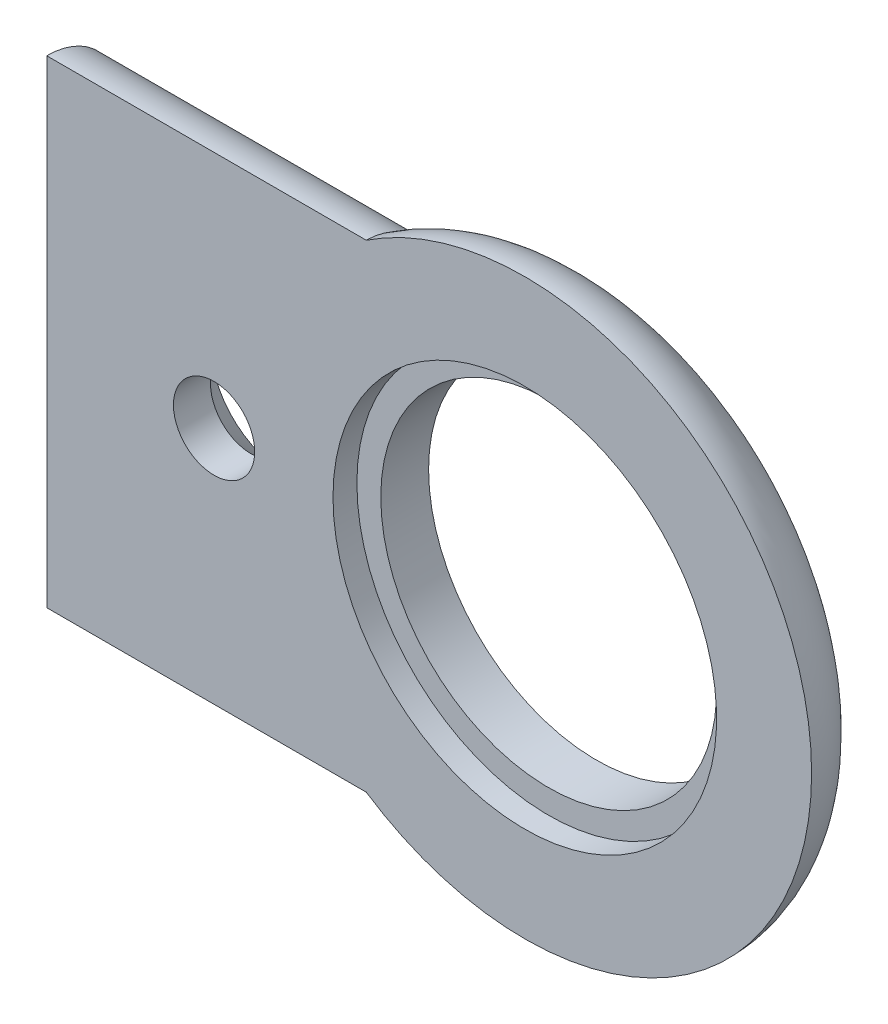
ISO-10303-21;
HEADER;
FILE_DESCRIPTION(('STEP AP214'),'2;1');
FILE_NAME('part.step','',(''),(''),'','','');
FILE_SCHEMA(('AUTOMOTIVE_DESIGN { 1 0 10303 214 1 1 1 1 }'));
ENDSEC;
DATA;
#1=APPLICATION_CONTEXT('core data for automotive mechanical design processes');
#2=APPLICATION_PROTOCOL_DEFINITION('international standard','automotive_design',2000,#1);
#3=PRODUCT_CONTEXT('',#1,'mechanical');
#4=PRODUCT('Part','Part','',(#3));
#5=PRODUCT_RELATED_PRODUCT_CATEGORY('part','',(#4));
#6=PRODUCT_DEFINITION_FORMATION('','',#4);
#7=PRODUCT_DEFINITION_CONTEXT('part definition',#1,'design');
#8=PRODUCT_DEFINITION('design','',#6,#7);
#9=PRODUCT_DEFINITION_SHAPE('','',#8);
#10=(LENGTH_UNIT() NAMED_UNIT(*) SI_UNIT(.MILLI.,.METRE.));
#11=(NAMED_UNIT(*) PLANE_ANGLE_UNIT() SI_UNIT($,.RADIAN.));
#12=(NAMED_UNIT(*) SI_UNIT($,.STERADIAN.) SOLID_ANGLE_UNIT());
#13=UNCERTAINTY_MEASURE_WITH_UNIT(LENGTH_MEASURE(1.E-05),#10,'distance_accuracy_value','');
#14=(GEOMETRIC_REPRESENTATION_CONTEXT(3) GLOBAL_UNCERTAINTY_ASSIGNED_CONTEXT((#13)) GLOBAL_UNIT_ASSIGNED_CONTEXT((#10,
#11,#12)) REPRESENTATION_CONTEXT('',''));
#15=CARTESIAN_POINT('',(0.,0.,0.));
#16=DIRECTION('',(0.,0.,1.));
#17=DIRECTION('',(1.,0.,0.));
#18=AXIS2_PLACEMENT_3D('',#15,#16,#17);
#19=CARTESIAN_POINT('',(145.,-12.01,3.));
#20=DIRECTION('',(1.,0.,0.));
#21=DIRECTION('',(0.,0.,-1.));
#22=AXIS2_PLACEMENT_3D('',#19,#20,#21);
#23=PLANE('',#22);
#24=CARTESIAN_POINT('',(145.,7.00000000000002,3.));
#25=DIRECTION('',(1.,0.,0.));
#26=DIRECTION('',(0.,0.,-1.));
#27=AXIS2_PLACEMENT_3D('',#24,#25,#26);
#28=CIRCLE('',#27,3.);
#29=CARTESIAN_POINT('',(145.,10.,3.));
#30=VERTEX_POINT('',#29);
#31=CARTESIAN_POINT('',(145.,7.00000000000002,0.));
#32=VERTEX_POINT('',#31);
#33=EDGE_CURVE('E49',#30,#32,#28,.F.);
#34=ORIENTED_EDGE('',*,*,#33,.T.);
#35=DIRECTION('',(0.,1.,0.));
#36=VECTOR('',#35,1.);
#37=CARTESIAN_POINT('',(145.,0.,0.));
#38=LINE('',#37,#36);
#39=CARTESIAN_POINT('',(145.,-7.00000000000002,0.));
#40=VERTEX_POINT('',#39);
#41=EDGE_CURVE('E92',#40,#32,#38,.T.);
#42=ORIENTED_EDGE('',*,*,#41,.F.);
#43=CARTESIAN_POINT('',(145.,-7.00000000000002,3.));
#44=DIRECTION('',(1.,0.,0.));
#45=DIRECTION('',(0.,0.,-1.));
#46=AXIS2_PLACEMENT_3D('',#43,#44,#45);
#47=CIRCLE('',#46,3.);
#48=CARTESIAN_POINT('',(145.,-10.,3.));
#49=VERTEX_POINT('',#48);
#50=EDGE_CURVE('E129',#40,#49,#47,.F.);
#51=ORIENTED_EDGE('',*,*,#50,.T.);
#52=DIRECTION('',(0.,1.,0.));
#53=VECTOR('',#52,1.);
#54=CARTESIAN_POINT('',(145.,-12.01,3.));
#55=LINE('',#54,#53);
#56=EDGE_CURVE('E12',#49,#30,#55,.T.);
#57=ORIENTED_EDGE('',*,*,#56,.T.);
#58=EDGE_LOOP('',(#34,#42,#51,#57));
#59=FACE_BOUND('',#58,.T.);
#60=ADVANCED_FACE('F50',(#59),#23,.F.);
#61=CARTESIAN_POINT('',(152.,0.,3.));
#62=DIRECTION('',(0.,0.,-1.));
#63=DIRECTION('',(-1.,0.,0.));
#64=AXIS2_PLACEMENT_3D('',#61,#62,#63);
#65=PLANE('',#64);
#66=CARTESIAN_POINT('',(152.,0.,3.));
#67=DIRECTION('',(0.,0.,-1.));
#68=DIRECTION('',(-1.,0.,0.));
#69=AXIS2_PLACEMENT_3D('',#66,#67,#68);
#70=CIRCLE('',#69,1.70000000000001);
#71=CARTESIAN_POINT('',(150.3,0.,3.));
#72=VERTEX_POINT('',#71);
#73=EDGE_CURVE('E173',#72,#72,#70,.F.);
#74=ORIENTED_EDGE('',*,*,#73,.F.);
#75=EDGE_LOOP('',(#74));
#76=FACE_BOUND('',#75,.T.);
#77=DIRECTION('',(1.,0.,0.));
#78=VECTOR('',#77,1.);
#79=CARTESIAN_POINT('',(6.6332495807108,10.,3.));
#80=LINE('',#79,#78);
#81=CARTESIAN_POINT('',(158.366750419289,10.,3.));
#82=VERTEX_POINT('',#81);
#83=EDGE_CURVE('E106',#82,#30,#80,.F.);
#84=ORIENTED_EDGE('',*,*,#83,.T.);
#85=ORIENTED_EDGE('',*,*,#56,.F.);
#86=DIRECTION('',(1.,0.,0.));
#87=VECTOR('',#86,1.);
#88=CARTESIAN_POINT('',(6.6332495807108,-10.,3.));
#89=LINE('',#88,#87);
#90=CARTESIAN_POINT('',(158.366750419289,-10.,3.));
#91=VERTEX_POINT('',#90);
#92=EDGE_CURVE('E54',#49,#91,#89,.T.);
#93=ORIENTED_EDGE('',*,*,#92,.T.);
#94=CARTESIAN_POINT('',(165.,0.,3.));
#95=DIRECTION('',(0.,0.,1.));
#96=DIRECTION('',(1.,0.,0.));
#97=AXIS2_PLACEMENT_3D('',#94,#95,#96);
#98=CIRCLE('',#97,12.);
#99=EDGE_CURVE('E65',#91,#82,#98,.T.);
#100=ORIENTED_EDGE('',*,*,#99,.T.);
#101=EDGE_LOOP('',(#84,#85,#93,#100));
#102=FACE_BOUND('',#101,.T.);
#103=CARTESIAN_POINT('',(165.,0.,3.));
#104=DIRECTION('',(0.,0.,-1.));
#105=DIRECTION('',(-1.,0.,0.));
#106=AXIS2_PLACEMENT_3D('',#103,#104,#105);
#107=CIRCLE('',#106,8.025);
#108=CARTESIAN_POINT('',(156.975,0.,3.));
#109=VERTEX_POINT('',#108);
#110=EDGE_CURVE('E176',#109,#109,#107,.F.);
#111=ORIENTED_EDGE('',*,*,#110,.F.);
#112=EDGE_LOOP('',(#111));
#113=FACE_BOUND('',#112,.T.);
#114=ADVANCED_FACE('F151',(#76,#102,#113),#65,.F.);
#115=CARTESIAN_POINT('',(165.,0.,9.));
#116=DIRECTION('',(0.,0.,-1.));
#117=DIRECTION('',(-1.,0.,0.));
#118=AXIS2_PLACEMENT_3D('',#115,#116,#117);
#119=CYLINDRICAL_SURFACE('',#118,7.025);
#120=CARTESIAN_POINT('',(165.,0.,0.));
#121=DIRECTION('',(0.,0.,-1.));
#122=DIRECTION('',(-1.,0.,0.));
#123=AXIS2_PLACEMENT_3D('',#120,#121,#122);
#124=CIRCLE('',#123,7.025);
#125=CARTESIAN_POINT('',(157.975,0.,0.));
#126=VERTEX_POINT('',#125);
#127=EDGE_CURVE('E108',#126,#126,#124,.T.);
#128=ORIENTED_EDGE('',*,*,#127,.T.);
#129=EDGE_LOOP('',(#128));
#130=FACE_BOUND('',#129,.T.);
#131=CARTESIAN_POINT('',(165.,0.,2.));
#132=DIRECTION('',(0.,0.,-1.));
#133=DIRECTION('',(-1.,0.,0.));
#134=AXIS2_PLACEMENT_3D('',#131,#132,#133);
#135=CIRCLE('',#134,7.025);
#136=CARTESIAN_POINT('',(157.975,0.,2.));
#137=VERTEX_POINT('',#136);
#138=EDGE_CURVE('E111',#137,#137,#135,.T.);
#139=ORIENTED_EDGE('',*,*,#138,.F.);
#140=EDGE_LOOP('',(#139));
#141=FACE_BOUND('',#140,.T.);
#142=ADVANCED_FACE('F148',(#130,#141),#119,.F.);
#143=CARTESIAN_POINT('',(152.,0.,0.));
#144=DIRECTION('',(0.,0.,-1.));
#145=DIRECTION('',(-1.,0.,0.));
#146=AXIS2_PLACEMENT_3D('',#143,#144,#145);
#147=CONICAL_SURFACE('',#146,3.15000000000001,0.785398163397449);
#148=CARTESIAN_POINT('',(152.,0.,1.45));
#149=DIRECTION('',(0.,0.,-1.));
#150=DIRECTION('',(-1.,0.,0.));
#151=AXIS2_PLACEMENT_3D('',#148,#149,#150);
#152=CIRCLE('',#151,1.70000000000001);
#153=CARTESIAN_POINT('',(150.3,0.,1.45));
#154=VERTEX_POINT('',#153);
#155=EDGE_CURVE('E113',#154,#154,#152,.T.);
#156=ORIENTED_EDGE('',*,*,#155,.F.);
#157=EDGE_LOOP('',(#156));
#158=FACE_BOUND('',#157,.T.);
#159=CARTESIAN_POINT('',(152.,0.,0.));
#160=DIRECTION('',(0.,0.,-1.));
#161=DIRECTION('',(-1.,0.,0.));
#162=AXIS2_PLACEMENT_3D('',#159,#160,#161);
#163=CIRCLE('',#162,3.15000000000001);
#164=CARTESIAN_POINT('',(148.85,0.,0.));
#165=VERTEX_POINT('',#164);
#166=EDGE_CURVE('E187',#165,#165,#163,.T.);
#167=ORIENTED_EDGE('',*,*,#166,.T.);
#168=EDGE_LOOP('',(#167));
#169=FACE_BOUND('',#168,.T.);
#170=ADVANCED_FACE('F155',(#158,#169),#147,.F.);
#171=CARTESIAN_POINT('',(152.,0.,0.));
#172=DIRECTION('',(0.,0.,-1.));
#173=DIRECTION('',(-1.,0.,0.));
#174=AXIS2_PLACEMENT_3D('',#171,#172,#173);
#175=CYLINDRICAL_SURFACE('',#174,1.70000000000001);
#176=ORIENTED_EDGE('',*,*,#73,.T.);
#177=EDGE_LOOP('',(#176));
#178=FACE_BOUND('',#177,.T.);
#179=ORIENTED_EDGE('',*,*,#155,.T.);
#180=EDGE_LOOP('',(#179));
#181=FACE_BOUND('',#180,.T.);
#182=ADVANCED_FACE('F157',(#178,#181),#175,.F.);
#183=CARTESIAN_POINT('',(165.,0.,3.));
#184=DIRECTION('',(0.,0.,1.));
#185=DIRECTION('',(1.,0.,0.));
#186=AXIS2_PLACEMENT_3D('',#183,#184,#185);
#187=TOROIDAL_SURFACE('',#186,9.00000000000003,3.);
#188=CARTESIAN_POINT('',(158.366750419289,-10.,3.));
#189=CARTESIAN_POINT('',(158.366748406548,-10.0000098535692,2.91832282811229));
#190=CARTESIAN_POINT('',(158.367756119082,-9.99666455428936,2.83665044575724));
#191=CARTESIAN_POINT('',(158.371775128652,-9.98333938667463,2.67390816869804));
#192=CARTESIAN_POINT('',(158.374786177691,-9.97336033954348,2.59283820067585));
#193=CARTESIAN_POINT('',(158.382788912227,-9.94686684749292,2.43201561954067));
#194=CARTESIAN_POINT('',(158.387777082286,-9.93036400241241,2.35226092854911));
#195=CARTESIAN_POINT('',(158.399698197228,-9.89098718371105,2.19451150225823));
#196=CARTESIAN_POINT('',(158.406631146236,-9.86811319658087,2.11651677069111));
#197=CARTESIAN_POINT('',(158.430293603664,-9.79019724346064,1.8859770239453));
#198=CARTESIAN_POINT('',(158.449893121657,-9.72583993009606,1.73674823986862));
#199=CARTESIAN_POINT('',(158.496248267667,-9.57456313707387,1.45153923327288));
#200=CARTESIAN_POINT('',(158.523004457229,-9.48764188696214,1.31556005152108));
#201=CARTESIAN_POINT('',(158.583564045909,-9.29243006025774,1.05802041816486));
#202=CARTESIAN_POINT('',(158.617476361481,-9.18381078859014,0.936734656339628));
#203=CARTESIAN_POINT('',(158.691315052031,-8.94953613474559,0.714076543196316));
#204=CARTESIAN_POINT('',(158.731243217371,-8.82387568210235,0.612710140791636));
#205=CARTESIAN_POINT('',(158.817979114909,-8.55385703409445,0.428362189085962));
#206=CARTESIAN_POINT('',(158.864999363909,-8.40894912932895,0.346287027879205));
#207=CARTESIAN_POINT('',(158.963614617624,-8.10888057219527,0.207564462053017));
#208=CARTESIAN_POINT('',(159.015209767454,-7.95371959463985,0.150917864372315));
#209=CARTESIAN_POINT('',(159.11169754666,-7.66755910857492,0.0721961315360057));
#210=CARTESIAN_POINT('',(159.155999727501,-7.53757385301958,0.0455960045550273));
#211=CARTESIAN_POINT('',(159.246227202724,-7.27596866612548,0.00981412465071258));
#212=CARTESIAN_POINT('',(159.292149241296,-7.14435232413626,0.000599257215181667));
#213=CARTESIAN_POINT('',(159.340075831448,-7.0086847995247,9.40499600647114E-06));
#214=CARTESIAN_POINT('',(159.341610540671,-7.00434221800044,-2.38091156650686E-08));
#215=CARTESIAN_POINT('',(159.343145750508,-7.00000000000002,0.));
#216=B_SPLINE_CURVE_WITH_KNOTS('',3,(#188,#189,#190,#191,#192,#193,#194,#195,#196,#197,#198,
#199,#200,#201,#202,#203,#204,#205,#206,#207,#208,#209,#210,#211,#212,#213,#214,#215),
.UNSPECIFIED.,.F.,.F.,(4,2,2,2,2,2,2,2,2,2,2,2,2,4),(0.,0.244948450351612,0.489866583732242,
0.734351177670228,0.97883629001557,1.46742101818896,1.95604409421152,2.45272325799537,
2.94955053024501,3.46641584921098,3.98329756899188,4.40191800726715,4.81974027154332,
4.83355763866565),.UNSPECIFIED.);
#217=CARTESIAN_POINT('',(159.343145750508,-7.00000000000001,0.));
#218=VERTEX_POINT('',#217);
#219=EDGE_CURVE('E101',#218,#91,#216,.F.);
#220=ORIENTED_EDGE('',*,*,#219,.F.);
#221=CARTESIAN_POINT('',(165.,0.,0.));
#222=DIRECTION('',(0.,0.,1.));
#223=DIRECTION('',(1.,0.,0.));
#224=AXIS2_PLACEMENT_3D('',#221,#222,#223);
#225=CIRCLE('',#224,9.00000000000003);
#226=CARTESIAN_POINT('',(159.343145750508,7.00000000000001,0.));
#227=VERTEX_POINT('',#226);
#228=EDGE_CURVE('E95',#227,#218,#225,.F.);
#229=ORIENTED_EDGE('',*,*,#228,.F.);
#230=CARTESIAN_POINT('',(158.366750419289,10.,3.));
#231=CARTESIAN_POINT('',(158.366748406548,10.0000098535692,2.91832282811229));
#232=CARTESIAN_POINT('',(158.367756119082,9.99666455428936,2.83665044575724));
#233=CARTESIAN_POINT('',(158.371775128652,9.98333938667463,2.67390816869804));
#234=CARTESIAN_POINT('',(158.374786177691,9.97336033954348,2.59283820067585));
#235=CARTESIAN_POINT('',(158.382788912227,9.94686684749292,2.43201561954067));
#236=CARTESIAN_POINT('',(158.387777082286,9.93036400241241,2.35226092854911));
#237=CARTESIAN_POINT('',(158.399698197228,9.89098718371105,2.19451150225823));
#238=CARTESIAN_POINT('',(158.406631146236,9.86811319658087,2.11651677069111));
#239=CARTESIAN_POINT('',(158.430293603664,9.79019724346064,1.8859770239453));
#240=CARTESIAN_POINT('',(158.449893121657,9.72583993009606,1.73674823986862));
#241=CARTESIAN_POINT('',(158.496248267667,9.57456313707387,1.45153923327288));
#242=CARTESIAN_POINT('',(158.523004457229,9.48764188696214,1.31556005152108));
#243=CARTESIAN_POINT('',(158.583564045909,9.29243006025774,1.05802041816486));
#244=CARTESIAN_POINT('',(158.617476361481,9.18381078859014,0.936734656339628));
#245=CARTESIAN_POINT('',(158.691315052031,8.94953613474559,0.714076543196316));
#246=CARTESIAN_POINT('',(158.731243217371,8.82387568210235,0.612710140791636));
#247=CARTESIAN_POINT('',(158.817979114909,8.55385703409445,0.428362189085962));
#248=CARTESIAN_POINT('',(158.864999363909,8.40894912932895,0.346287027879205));
#249=CARTESIAN_POINT('',(158.963614617624,8.10888057219527,0.207564462053017));
#250=CARTESIAN_POINT('',(159.015209767454,7.95371959463985,0.150917864372315));
#251=CARTESIAN_POINT('',(159.11169754666,7.66755910857492,0.0721961315360058));
#252=CARTESIAN_POINT('',(159.155999727501,7.53757385301958,0.0455960045550275));
#253=CARTESIAN_POINT('',(159.246227202724,7.27596866612548,0.00981412465071292));
#254=CARTESIAN_POINT('',(159.292149241296,7.14435232413626,0.00059925721518196));
#255=CARTESIAN_POINT('',(159.340075831448,7.0086847995247,9.40499600648946E-06));
#256=CARTESIAN_POINT('',(159.341610540671,7.00434221800044,-2.38091156557845E-08));
#257=CARTESIAN_POINT('',(159.343145750508,7.00000000000002,0.));
#258=B_SPLINE_CURVE_WITH_KNOTS('',3,(#230,#231,#232,#233,#234,#235,#236,#237,#238,#239,#240,
#241,#242,#243,#244,#245,#246,#247,#248,#249,#250,#251,#252,#253,#254,#255,#256,#257),
.UNSPECIFIED.,.F.,.F.,(4,2,2,2,2,2,2,2,2,2,2,2,2,4),(0.,0.244948450351612,0.489866583732241,
0.734351177670228,0.97883629001557,1.46742101818896,1.95604409421152,2.45272325799537,
2.94955053024501,3.46641584921098,3.98329756899188,4.40191800726715,4.81974027154332,
4.83355763866565),.UNSPECIFIED.);
#259=EDGE_CURVE('E105',#82,#227,#258,.T.);
#260=ORIENTED_EDGE('',*,*,#259,.F.);
#261=ORIENTED_EDGE('',*,*,#99,.F.);
#262=EDGE_LOOP('',(#220,#229,#260,#261));
#263=FACE_BOUND('',#262,.T.);
#264=ADVANCED_FACE('F102',(#263),#187,.T.);
#265=CARTESIAN_POINT('',(0.,0.,0.));
#266=DIRECTION('',(0.,0.,1.));
#267=DIRECTION('',(1.,0.,0.));
#268=AXIS2_PLACEMENT_3D('',#265,#266,#267);
#269=PLANE('',#268);
#270=ORIENTED_EDGE('',*,*,#166,.F.);
#271=EDGE_LOOP('',(#270));
#272=FACE_BOUND('',#271,.T.);
#273=DIRECTION('',(1.,0.,0.));
#274=VECTOR('',#273,1.);
#275=CARTESIAN_POINT('',(0.,-7.,0.));
#276=LINE('',#275,#274);
#277=EDGE_CURVE('E98',#218,#40,#276,.F.);
#278=ORIENTED_EDGE('',*,*,#277,.T.);
#279=ORIENTED_EDGE('',*,*,#41,.T.);
#280=DIRECTION('',(1.,0.,0.));
#281=VECTOR('',#280,1.);
#282=CARTESIAN_POINT('',(158.366750419289,7.00000000000002,0.));
#283=LINE('',#282,#281);
#284=EDGE_CURVE('E90',#32,#227,#283,.T.);
#285=ORIENTED_EDGE('',*,*,#284,.T.);
#286=ORIENTED_EDGE('',*,*,#228,.T.);
#287=EDGE_LOOP('',(#278,#279,#285,#286));
#288=FACE_BOUND('',#287,.T.);
#289=ORIENTED_EDGE('',*,*,#127,.F.);
#290=EDGE_LOOP('',(#289));
#291=FACE_BOUND('',#290,.T.);
#292=ADVANCED_FACE('F89',(#272,#288,#291),#269,.F.);
#293=CARTESIAN_POINT('',(6.6332495807108,-7.,3.));
#294=DIRECTION('',(1.,0.,0.));
#295=DIRECTION('',(0.,1.,0.));
#296=AXIS2_PLACEMENT_3D('',#293,#294,#295);
#297=CYLINDRICAL_SURFACE('',#296,3.);
#298=ORIENTED_EDGE('',*,*,#50,.F.);
#299=ORIENTED_EDGE('',*,*,#277,.F.);
#300=ORIENTED_EDGE('',*,*,#219,.T.);
#301=ORIENTED_EDGE('',*,*,#92,.F.);
#302=EDGE_LOOP('',(#298,#299,#300,#301));
#303=FACE_BOUND('',#302,.T.);
#304=ADVANCED_FACE('F134',(#303),#297,.T.);
#305=CARTESIAN_POINT('',(0.,7.,3.));
#306=DIRECTION('',(-1.,0.,0.));
#307=DIRECTION('',(0.,-1.,0.));
#308=AXIS2_PLACEMENT_3D('',#305,#306,#307);
#309=CYLINDRICAL_SURFACE('',#308,3.);
#310=ORIENTED_EDGE('',*,*,#33,.F.);
#311=ORIENTED_EDGE('',*,*,#83,.F.);
#312=ORIENTED_EDGE('',*,*,#259,.T.);
#313=ORIENTED_EDGE('',*,*,#284,.F.);
#314=EDGE_LOOP('',(#310,#311,#312,#313));
#315=FACE_BOUND('',#314,.T.);
#316=ADVANCED_FACE('F110',(#315),#309,.T.);
#317=CARTESIAN_POINT('',(165.,0.,2.));
#318=DIRECTION('',(0.,0.,-1.));
#319=DIRECTION('',(-1.,0.,0.));
#320=AXIS2_PLACEMENT_3D('',#317,#318,#319);
#321=PLANE('',#320);
#322=ORIENTED_EDGE('',*,*,#138,.T.);
#323=EDGE_LOOP('',(#322));
#324=FACE_BOUND('',#323,.T.);
#325=CARTESIAN_POINT('',(165.,0.,2.));
#326=DIRECTION('',(0.,0.,-1.));
#327=DIRECTION('',(-1.,0.,0.));
#328=AXIS2_PLACEMENT_3D('',#325,#326,#327);
#329=CIRCLE('',#328,8.025);
#330=CARTESIAN_POINT('',(156.975,0.,2.));
#331=VERTEX_POINT('',#330);
#332=EDGE_CURVE('E107',#331,#331,#329,.T.);
#333=ORIENTED_EDGE('',*,*,#332,.F.);
#334=EDGE_LOOP('',(#333));
#335=FACE_BOUND('',#334,.T.);
#336=ADVANCED_FACE('F132',(#324,#335),#321,.F.);
#337=CARTESIAN_POINT('',(165.,0.,31.6981276760882));
#338=DIRECTION('',(0.,0.,-1.));
#339=DIRECTION('',(-1.,0.,0.));
#340=AXIS2_PLACEMENT_3D('',#337,#338,#339);
#341=CYLINDRICAL_SURFACE('',#340,8.025);
#342=CARTESIAN_POINT('',(156.975,0.,3.));
#343=CARTESIAN_POINT('',(156.975,0.,2.98958333333333));
#344=CARTESIAN_POINT('',(156.975,0.,2.97916666666667));
#345=CARTESIAN_POINT('',(156.975,0.,2.95833333333333));
#346=CARTESIAN_POINT('',(156.975,0.,2.94791666666667));
#347=CARTESIAN_POINT('',(156.975,0.,2.92708333333333));
#348=CARTESIAN_POINT('',(156.975,0.,2.91666666666667));
#349=CARTESIAN_POINT('',(156.975,0.,2.89583333333333));
#350=CARTESIAN_POINT('',(156.975,0.,2.88541666666667));
#351=CARTESIAN_POINT('',(156.975,0.,2.86458333333333));
#352=CARTESIAN_POINT('',(156.975,0.,2.85416666666667));
#353=CARTESIAN_POINT('',(156.975,0.,2.83333333333333));
#354=CARTESIAN_POINT('',(156.975,0.,2.82291666666667));
#355=CARTESIAN_POINT('',(156.975,0.,2.80208333333333));
#356=CARTESIAN_POINT('',(156.975,0.,2.79166666666667));
#357=CARTESIAN_POINT('',(156.975,0.,2.77083333333333));
#358=CARTESIAN_POINT('',(156.975,0.,2.76041666666667));
#359=CARTESIAN_POINT('',(156.975,0.,2.73958333333333));
#360=CARTESIAN_POINT('',(156.975,0.,2.72916666666667));
#361=CARTESIAN_POINT('',(156.975,0.,2.70833333333333));
#362=CARTESIAN_POINT('',(156.975,0.,2.69791666666667));
#363=CARTESIAN_POINT('',(156.975,0.,2.67708333333333));
#364=CARTESIAN_POINT('',(156.975,0.,2.66666666666667));
#365=CARTESIAN_POINT('',(156.975,0.,2.64583333333333));
#366=CARTESIAN_POINT('',(156.975,0.,2.63541666666667));
#367=CARTESIAN_POINT('',(156.975,0.,2.61458333333333));
#368=CARTESIAN_POINT('',(156.975,0.,2.60416666666667));
#369=CARTESIAN_POINT('',(156.975,0.,2.58333333333333));
#370=CARTESIAN_POINT('',(156.975,0.,2.57291666666667));
#371=CARTESIAN_POINT('',(156.975,0.,2.55208333333333));
#372=CARTESIAN_POINT('',(156.975,0.,2.54166666666667));
#373=CARTESIAN_POINT('',(156.975,0.,2.52083333333333));
#374=CARTESIAN_POINT('',(156.975,0.,2.51041666666667));
#375=CARTESIAN_POINT('',(156.975,0.,2.48958333333333));
#376=CARTESIAN_POINT('',(156.975,0.,2.47916666666667));
#377=CARTESIAN_POINT('',(156.975,0.,2.45833333333333));
#378=CARTESIAN_POINT('',(156.975,0.,2.44791666666667));
#379=CARTESIAN_POINT('',(156.975,0.,2.42708333333333));
#380=CARTESIAN_POINT('',(156.975,0.,2.41666666666667));
#381=CARTESIAN_POINT('',(156.975,0.,2.39583333333333));
#382=CARTESIAN_POINT('',(156.975,0.,2.38541666666667));
#383=CARTESIAN_POINT('',(156.975,0.,2.36458333333333));
#384=CARTESIAN_POINT('',(156.975,0.,2.35416666666667));
#385=CARTESIAN_POINT('',(156.975,0.,2.33333333333333));
#386=CARTESIAN_POINT('',(156.975,0.,2.32291666666667));
#387=CARTESIAN_POINT('',(156.975,0.,2.30208333333333));
#388=CARTESIAN_POINT('',(156.975,0.,2.29166666666667));
#389=CARTESIAN_POINT('',(156.975,0.,2.27083333333333));
#390=CARTESIAN_POINT('',(156.975,0.,2.26041666666667));
#391=CARTESIAN_POINT('',(156.975,0.,2.23958333333333));
#392=CARTESIAN_POINT('',(156.975,0.,2.22916666666667));
#393=CARTESIAN_POINT('',(156.975,0.,2.20833333333333));
#394=CARTESIAN_POINT('',(156.975,0.,2.19791666666667));
#395=CARTESIAN_POINT('',(156.975,0.,2.17708333333333));
#396=CARTESIAN_POINT('',(156.975,0.,2.16666666666667));
#397=CARTESIAN_POINT('',(156.975,0.,2.14583333333333));
#398=CARTESIAN_POINT('',(156.975,0.,2.13541666666667));
#399=CARTESIAN_POINT('',(156.975,0.,2.11458333333333));
#400=CARTESIAN_POINT('',(156.975,0.,2.10416666666667));
#401=CARTESIAN_POINT('',(156.975,0.,2.08333333333333));
#402=CARTESIAN_POINT('',(156.975,0.,2.07291666666667));
#403=CARTESIAN_POINT('',(156.975,0.,2.05208333333333));
#404=CARTESIAN_POINT('',(156.975,0.,2.04166666666667));
#405=CARTESIAN_POINT('',(156.975,0.,2.02083333333333));
#406=CARTESIAN_POINT('',(156.975,0.,2.01041666666667));
#407=CARTESIAN_POINT('',(156.975,0.,2.));
#408=B_SPLINE_CURVE_WITH_KNOTS('',3,(#342,#343,#344,#345,#346,#347,#348,#349,#350,#351,#352,
#353,#354,#355,#356,#357,#358,#359,#360,#361,#362,#363,#364,#365,#366,#367,#368,#369,#370,#371,
#372,#373,#374,#375,#376,#377,#378,#379,#380,#381,#382,#383,#384,#385,#386,#387,#388,#389,#390,
#391,#392,#393,#394,#395,#396,#397,#398,#399,#400,#401,#402,#403,#404,#405,#406,#407),
.UNSPECIFIED.,.F.,.F.,(4,2,2,2,2,2,2,2,2,2,2,2,2,2,2,2,2,2,2,2,2,2,2,2,2,2,2,2,2,2,2,2,4),(0.,
0.03125,0.0625000000000001,0.0937500000000001,0.125,0.15625,0.1875,0.21875,0.25,0.28125,0.3125,
0.34375,0.375,0.40625,0.4375,0.46875,0.5,0.53125,0.5625,0.593750000000001,0.625000000000001,
0.656250000000001,0.687500000000001,0.718750000000001,0.750000000000001,0.781250000000001,
0.812500000000001,0.843750000000001,0.875000000000001,0.906250000000001,0.937500000000001,
0.968750000000001,1.),.UNSPECIFIED.);
#409=EDGE_CURVE('BSEAM144',#109,#331,#408,.T.);
#410=ORIENTED_EDGE('',*,*,#110,.T.);
#411=ORIENTED_EDGE('',*,*,#332,.T.);
#412=ORIENTED_EDGE('',*,*,#409,.T.);
#413=ORIENTED_EDGE('',*,*,#409,.F.);
#414=EDGE_LOOP('',(#410,#412,#411,#413));
#415=FACE_BOUND('',#414,.T.);
#416=ADVANCED_FACE('F144',(#415),#341,.F.);
#417=CLOSED_SHELL('',(#60,#114,#142,#170,#182,#264,#292,#304,#316,#336,#416));
#418=MANIFOLD_SOLID_BREP('B2',#417);
#419=ADVANCED_BREP_SHAPE_REPRESENTATION('',(#18,#418),#14);
#420=SHAPE_DEFINITION_REPRESENTATION(#9,#419);
ENDSEC;
END-ISO-10303-21;
